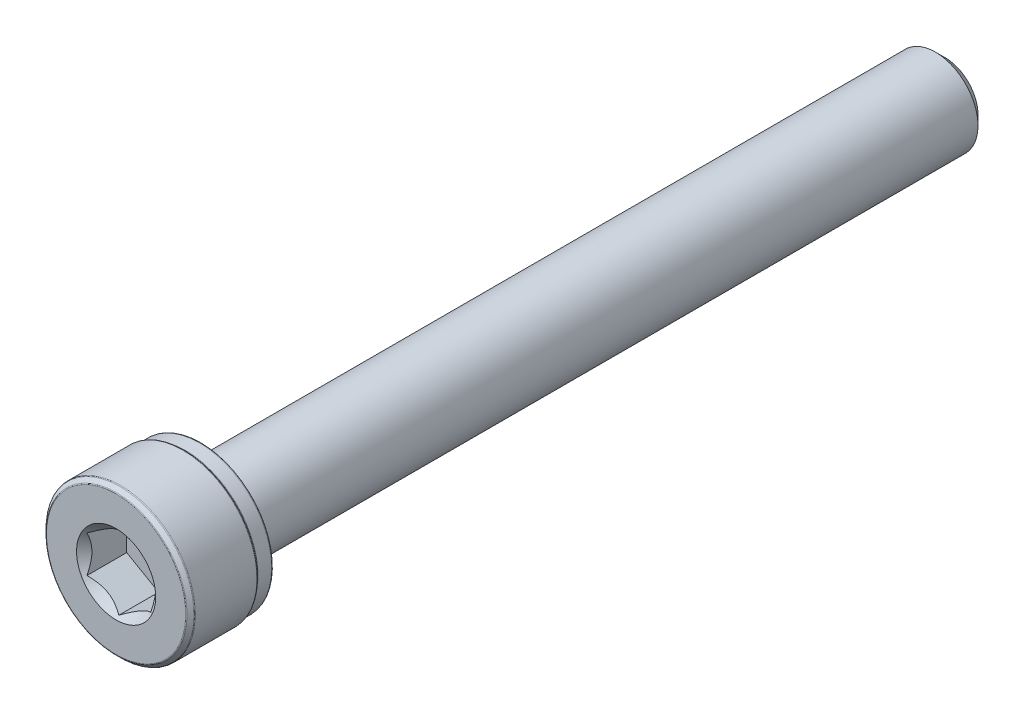
ISO-10303-21;
HEADER;
FILE_DESCRIPTION(('STEP AP214'),'2;1');
FILE_NAME('part.step','',(''),(''),'','','');
FILE_SCHEMA(('AUTOMOTIVE_DESIGN { 1 0 10303 214 1 1 1 1 }'));
ENDSEC;
DATA;
#1=APPLICATION_CONTEXT('core data for automotive mechanical design processes');
#2=APPLICATION_PROTOCOL_DEFINITION('international standard','automotive_design',2000,#1);
#3=PRODUCT_CONTEXT('',#1,'mechanical');
#4=PRODUCT('Part','Part','',(#3));
#5=PRODUCT_RELATED_PRODUCT_CATEGORY('part','',(#4));
#6=PRODUCT_DEFINITION_FORMATION('','',#4);
#7=PRODUCT_DEFINITION_CONTEXT('part definition',#1,'design');
#8=PRODUCT_DEFINITION('design','',#6,#7);
#9=PRODUCT_DEFINITION_SHAPE('','',#8);
#10=(LENGTH_UNIT() NAMED_UNIT(*) SI_UNIT(.MILLI.,.METRE.));
#11=(NAMED_UNIT(*) PLANE_ANGLE_UNIT() SI_UNIT($,.RADIAN.));
#12=(NAMED_UNIT(*) SI_UNIT($,.STERADIAN.) SOLID_ANGLE_UNIT());
#13=UNCERTAINTY_MEASURE_WITH_UNIT(LENGTH_MEASURE(1.E-05),#10,'distance_accuracy_value','');
#14=(GEOMETRIC_REPRESENTATION_CONTEXT(3) GLOBAL_UNCERTAINTY_ASSIGNED_CONTEXT((#13)) GLOBAL_UNIT_ASSIGNED_CONTEXT((#10,
#11,#12)) REPRESENTATION_CONTEXT('',''));
#15=CARTESIAN_POINT('',(0.,0.,0.));
#16=DIRECTION('',(0.,0.,1.));
#17=DIRECTION('',(1.,0.,0.));
#18=AXIS2_PLACEMENT_3D('',#15,#16,#17);
#19=CARTESIAN_POINT('',(0.,1.54533666301317,-19.5));
#20=DIRECTION('',(0.,0.,-1.));
#21=DIRECTION('',(0.,1.,0.));
#22=AXIS2_PLACEMENT_3D('',#19,#20,#21);
#23=PLANE('',#22);
#24=CARTESIAN_POINT('',(0.,0.,-19.5));
#25=DIRECTION('',(0.,0.,-1.));
#26=DIRECTION('',(0.,1.,0.));
#27=AXIS2_PLACEMENT_3D('',#24,#25,#26);
#28=CIRCLE('',#27,1.54533666301317);
#29=CARTESIAN_POINT('',(0.,1.54533666301317,-19.5));
#30=VERTEX_POINT('',#29);
#31=EDGE_CURVE('E51',#30,#30,#28,.T.);
#32=ORIENTED_EDGE('',*,*,#31,.T.);
#33=EDGE_LOOP('',(#32));
#34=FACE_BOUND('',#33,.T.);
#35=ADVANCED_FACE('F38',(#34),#23,.T.);
#36=CARTESIAN_POINT('',(0.,0.,-19.5));
#37=DIRECTION('',(0.,0.,1.));
#38=DIRECTION('',(0.,-1.,0.));
#39=AXIS2_PLACEMENT_3D('',#36,#37,#38);
#40=CONICAL_SURFACE('',#39,1.54533666301317,0.785398163397444);
#41=CARTESIAN_POINT('',(0.,0.,-19.0453366630132));
#42=DIRECTION('',(0.,0.,-1.));
#43=DIRECTION('',(0.,1.,0.));
#44=AXIS2_PLACEMENT_3D('',#41,#42,#43);
#45=CIRCLE('',#44,2.);
#46=CARTESIAN_POINT('',(0.,2.,-19.0453366630132));
#47=VERTEX_POINT('',#46);
#48=EDGE_CURVE('E157',#47,#47,#45,.T.);
#49=ORIENTED_EDGE('',*,*,#48,.T.);
#50=EDGE_LOOP('',(#49));
#51=FACE_BOUND('',#50,.T.);
#52=ORIENTED_EDGE('',*,*,#31,.F.);
#53=EDGE_LOOP('',(#52));
#54=FACE_BOUND('',#53,.T.);
#55=ADVANCED_FACE('F163',(#51,#54),#40,.T.);
#56=CARTESIAN_POINT('',(0.,0.,-19.5));
#57=DIRECTION('',(0.,0.,-1.));
#58=DIRECTION('',(0.,1.,0.));
#59=AXIS2_PLACEMENT_3D('',#56,#57,#58);
#60=CYLINDRICAL_SURFACE('',#59,2.);
#61=CARTESIAN_POINT('',(0.,0.,15.3));
#62=DIRECTION('',(0.,0.,-1.));
#63=DIRECTION('',(0.,1.,0.));
#64=AXIS2_PLACEMENT_3D('',#61,#62,#63);
#65=CIRCLE('',#64,2.);
#66=CARTESIAN_POINT('',(0.,2.,15.3));
#67=VERTEX_POINT('',#66);
#68=EDGE_CURVE('E154',#67,#67,#65,.T.);
#69=ORIENTED_EDGE('',*,*,#68,.T.);
#70=EDGE_LOOP('',(#69));
#71=FACE_BOUND('',#70,.T.);
#72=ORIENTED_EDGE('',*,*,#48,.F.);
#73=EDGE_LOOP('',(#72));
#74=FACE_BOUND('',#73,.T.);
#75=ADVANCED_FACE('F165',(#71,#74),#60,.T.);
#76=CARTESIAN_POINT('',(0.,0.,15.3));
#77=DIRECTION('',(0.,0.,-1.));
#78=DIRECTION('',(0.,1.,0.));
#79=AXIS2_PLACEMENT_3D('',#76,#77,#78);
#80=TOROIDAL_SURFACE('',#79,2.2,0.199999999999998);
#81=CARTESIAN_POINT('',(0.,0.,15.5));
#82=DIRECTION('',(0.,0.,-1.));
#83=DIRECTION('',(0.,1.,0.));
#84=AXIS2_PLACEMENT_3D('',#81,#82,#83);
#85=CIRCLE('',#84,2.2);
#86=CARTESIAN_POINT('',(0.,2.2,15.5));
#87=VERTEX_POINT('',#86);
#88=EDGE_CURVE('E151',#87,#87,#85,.T.);
#89=ORIENTED_EDGE('',*,*,#88,.T.);
#90=EDGE_LOOP('',(#89));
#91=FACE_BOUND('',#90,.T.);
#92=ORIENTED_EDGE('',*,*,#68,.F.);
#93=EDGE_LOOP('',(#92));
#94=FACE_BOUND('',#93,.T.);
#95=ADVANCED_FACE('F171',(#91,#94),#80,.F.);
#96=CARTESIAN_POINT('',(0.,3.3125,15.5));
#97=DIRECTION('',(0.,0.,-1.));
#98=DIRECTION('',(0.,1.,0.));
#99=AXIS2_PLACEMENT_3D('',#96,#97,#98);
#100=PLANE('',#99);
#101=CARTESIAN_POINT('',(0.,0.,15.5));
#102=DIRECTION('',(0.,0.,-1.));
#103=DIRECTION('',(0.,1.,0.));
#104=AXIS2_PLACEMENT_3D('',#101,#102,#103);
#105=CIRCLE('',#104,3.3125);
#106=CARTESIAN_POINT('',(0.,3.3125,15.5));
#107=VERTEX_POINT('',#106);
#108=EDGE_CURVE('E148',#107,#107,#105,.T.);
#109=ORIENTED_EDGE('',*,*,#108,.T.);
#110=EDGE_LOOP('',(#109));
#111=FACE_BOUND('',#110,.T.);
#112=ORIENTED_EDGE('',*,*,#88,.F.);
#113=EDGE_LOOP('',(#112));
#114=FACE_BOUND('',#113,.T.);
#115=ADVANCED_FACE('F177',(#111,#114),#100,.T.);
#116=CARTESIAN_POINT('',(0.,0.,15.5875));
#117=DIRECTION('',(0.,0.,-1.));
#118=DIRECTION('',(0.,1.,0.));
#119=AXIS2_PLACEMENT_3D('',#116,#117,#118);
#120=TOROIDAL_SURFACE('',#119,3.3125,0.087499999999999);
#121=CARTESIAN_POINT('',(0.,0.,15.5875));
#122=DIRECTION('',(0.,0.,-1.));
#123=DIRECTION('',(0.,1.,0.));
#124=AXIS2_PLACEMENT_3D('',#121,#122,#123);
#125=CIRCLE('',#124,3.4);
#126=CARTESIAN_POINT('',(0.,3.4,15.5875));
#127=VERTEX_POINT('',#126);
#128=EDGE_CURVE('E145',#127,#127,#125,.T.);
#129=ORIENTED_EDGE('',*,*,#128,.T.);
#130=EDGE_LOOP('',(#129));
#131=FACE_BOUND('',#130,.T.);
#132=ORIENTED_EDGE('',*,*,#108,.F.);
#133=EDGE_LOOP('',(#132));
#134=FACE_BOUND('',#133,.T.);
#135=ADVANCED_FACE('F181',(#131,#134),#120,.T.);
#136=CARTESIAN_POINT('',(0.,0.,-19.5));
#137=DIRECTION('',(0.,0.,-1.));
#138=DIRECTION('',(0.,1.,0.));
#139=AXIS2_PLACEMENT_3D('',#136,#137,#138);
#140=CYLINDRICAL_SURFACE('',#139,3.4);
#141=CARTESIAN_POINT('',(0.,0.,16.2241116523517));
#142=DIRECTION('',(0.,0.,-1.));
#143=DIRECTION('',(0.,1.,0.));
#144=AXIS2_PLACEMENT_3D('',#141,#142,#143);
#145=CIRCLE('',#144,3.4);
#146=CARTESIAN_POINT('',(0.,3.4,16.2241116523517));
#147=VERTEX_POINT('',#146);
#148=EDGE_CURVE('E142',#147,#147,#145,.T.);
#149=ORIENTED_EDGE('',*,*,#148,.T.);
#150=EDGE_LOOP('',(#149));
#151=FACE_BOUND('',#150,.T.);
#152=ORIENTED_EDGE('',*,*,#128,.F.);
#153=EDGE_LOOP('',(#152));
#154=FACE_BOUND('',#153,.T.);
#155=ADVANCED_FACE('F185',(#151,#154),#140,.T.);
#156=CARTESIAN_POINT('',(0.,0.,16.2241116523517));
#157=DIRECTION('',(0.,0.,-1.));
#158=DIRECTION('',(0.,1.,0.));
#159=AXIS2_PLACEMENT_3D('',#156,#157,#158);
#160=TOROIDAL_SURFACE('',#159,3.4625,0.0625000000000005);
#161=CARTESIAN_POINT('',(0.,0.,16.2683058261758));
#162=DIRECTION('',(0.,0.,-1.));
#163=DIRECTION('',(0.,1.,0.));
#164=AXIS2_PLACEMENT_3D('',#161,#162,#163);
#165=CIRCLE('',#164,3.41830582617584);
#166=CARTESIAN_POINT('',(0.,3.41830582617584,16.2683058261758));
#167=VERTEX_POINT('',#166);
#168=EDGE_CURVE('E139',#167,#167,#165,.T.);
#169=ORIENTED_EDGE('',*,*,#168,.T.);
#170=EDGE_LOOP('',(#169));
#171=FACE_BOUND('',#170,.T.);
#172=ORIENTED_EDGE('',*,*,#148,.F.);
#173=EDGE_LOOP('',(#172));
#174=FACE_BOUND('',#173,.T.);
#175=ADVANCED_FACE('F189',(#171,#174),#160,.F.);
#176=CARTESIAN_POINT('',(0.,0.,16.2683058261758));
#177=DIRECTION('',(0.,0.,1.));
#178=DIRECTION('',(0.,-1.,0.));
#179=AXIS2_PLACEMENT_3D('',#176,#177,#178);
#180=CONICAL_SURFACE('',#179,3.41830582617584,0.785398163397493);
#181=CARTESIAN_POINT('',(0.,0.,16.3316941738242));
#182=DIRECTION('',(0.,0.,-1.));
#183=DIRECTION('',(0.,1.,0.));
#184=AXIS2_PLACEMENT_3D('',#181,#182,#183);
#185=CIRCLE('',#184,3.48169417382416);
#186=CARTESIAN_POINT('',(0.,3.48169417382416,16.3316941738242));
#187=VERTEX_POINT('',#186);
#188=EDGE_CURVE('E136',#187,#187,#185,.T.);
#189=ORIENTED_EDGE('',*,*,#188,.T.);
#190=EDGE_LOOP('',(#189));
#191=FACE_BOUND('',#190,.T.);
#192=ORIENTED_EDGE('',*,*,#168,.F.);
#193=EDGE_LOOP('',(#192));
#194=FACE_BOUND('',#193,.T.);
#195=ADVANCED_FACE('F193',(#191,#194),#180,.T.);
#196=CARTESIAN_POINT('',(0.,0.,16.3758883476483));
#197=DIRECTION('',(0.,0.,-1.));
#198=DIRECTION('',(0.,1.,0.));
#199=AXIS2_PLACEMENT_3D('',#196,#197,#198);
#200=TOROIDAL_SURFACE('',#199,3.4375,0.0624999999999981);
#201=CARTESIAN_POINT('',(0.,0.,16.3758883476483));
#202=DIRECTION('',(0.,0.,-1.));
#203=DIRECTION('',(0.,1.,0.));
#204=AXIS2_PLACEMENT_3D('',#201,#202,#203);
#205=CIRCLE('',#204,3.5);
#206=CARTESIAN_POINT('',(0.,3.5,16.3758883476483));
#207=VERTEX_POINT('',#206);
#208=EDGE_CURVE('E133',#207,#207,#205,.T.);
#209=ORIENTED_EDGE('',*,*,#208,.T.);
#210=EDGE_LOOP('',(#209));
#211=FACE_BOUND('',#210,.T.);
#212=ORIENTED_EDGE('',*,*,#188,.F.);
#213=EDGE_LOOP('',(#212));
#214=FACE_BOUND('',#213,.T.);
#215=ADVANCED_FACE('F197',(#211,#214),#200,.T.);
#216=CARTESIAN_POINT('',(0.,0.,-19.5));
#217=DIRECTION('',(0.,0.,-1.));
#218=DIRECTION('',(0.,1.,0.));
#219=AXIS2_PLACEMENT_3D('',#216,#217,#218);
#220=CYLINDRICAL_SURFACE('',#219,3.5);
#221=CARTESIAN_POINT('',(0.,0.,19.2741116523517));
#222=DIRECTION('',(0.,0.,-1.));
#223=DIRECTION('',(0.,1.,0.));
#224=AXIS2_PLACEMENT_3D('',#221,#222,#223);
#225=CIRCLE('',#224,3.5);
#226=CARTESIAN_POINT('',(0.,3.5,19.2741116523517));
#227=VERTEX_POINT('',#226);
#228=EDGE_CURVE('E130',#227,#227,#225,.T.);
#229=ORIENTED_EDGE('',*,*,#228,.T.);
#230=EDGE_LOOP('',(#229));
#231=FACE_BOUND('',#230,.T.);
#232=ORIENTED_EDGE('',*,*,#208,.F.);
#233=EDGE_LOOP('',(#232));
#234=FACE_BOUND('',#233,.T.);
#235=ADVANCED_FACE('F201',(#231,#234),#220,.T.);
#236=CARTESIAN_POINT('',(0.,0.,19.2741116523517));
#237=DIRECTION('',(0.,0.,-1.));
#238=DIRECTION('',(0.,1.,0.));
#239=AXIS2_PLACEMENT_3D('',#236,#237,#238);
#240=TOROIDAL_SURFACE('',#239,3.4375,0.0625000000000011);
#241=CARTESIAN_POINT('',(0.,0.,19.3183058261758));
#242=DIRECTION('',(0.,0.,-1.));
#243=DIRECTION('',(0.,1.,0.));
#244=AXIS2_PLACEMENT_3D('',#241,#242,#243);
#245=CIRCLE('',#244,3.48169417382416);
#246=CARTESIAN_POINT('',(0.,3.48169417382416,19.3183058261758));
#247=VERTEX_POINT('',#246);
#248=EDGE_CURVE('E127',#247,#247,#245,.T.);
#249=ORIENTED_EDGE('',*,*,#248,.T.);
#250=EDGE_LOOP('',(#249));
#251=FACE_BOUND('',#250,.T.);
#252=ORIENTED_EDGE('',*,*,#228,.F.);
#253=EDGE_LOOP('',(#252));
#254=FACE_BOUND('',#253,.T.);
#255=ADVANCED_FACE('F205',(#251,#254),#240,.T.);
#256=CARTESIAN_POINT('',(0.,0.,19.3183058261758));
#257=DIRECTION('',(0.,0.,-1.));
#258=DIRECTION('',(0.,1.,0.));
#259=AXIS2_PLACEMENT_3D('',#256,#257,#258);
#260=CONICAL_SURFACE('',#259,3.48169417382416,0.785398163397454);
#261=CARTESIAN_POINT('',(0.,0.,19.4816941738242));
#262=DIRECTION('',(0.,0.,-1.));
#263=DIRECTION('',(0.,1.,0.));
#264=AXIS2_PLACEMENT_3D('',#261,#262,#263);
#265=CIRCLE('',#264,3.31830582617584);
#266=CARTESIAN_POINT('',(0.,3.31830582617584,19.4816941738242));
#267=VERTEX_POINT('',#266);
#268=EDGE_CURVE('E124',#267,#267,#265,.T.);
#269=ORIENTED_EDGE('',*,*,#268,.T.);
#270=EDGE_LOOP('',(#269));
#271=FACE_BOUND('',#270,.T.);
#272=ORIENTED_EDGE('',*,*,#248,.F.);
#273=EDGE_LOOP('',(#272));
#274=FACE_BOUND('',#273,.T.);
#275=ADVANCED_FACE('F209',(#271,#274),#260,.T.);
#276=CARTESIAN_POINT('',(0.,0.,19.4375));
#277=DIRECTION('',(0.,0.,-1.));
#278=DIRECTION('',(0.,1.,0.));
#279=AXIS2_PLACEMENT_3D('',#276,#277,#278);
#280=TOROIDAL_SURFACE('',#279,3.27411165235168,0.0624999999999999);
#281=CARTESIAN_POINT('',(0.,0.,19.5));
#282=DIRECTION('',(0.,0.,-1.));
#283=DIRECTION('',(0.,1.,0.));
#284=AXIS2_PLACEMENT_3D('',#281,#282,#283);
#285=CIRCLE('',#284,3.27411165235168);
#286=CARTESIAN_POINT('',(0.,3.27411165235168,19.5));
#287=VERTEX_POINT('',#286);
#288=EDGE_CURVE('E121',#287,#287,#285,.T.);
#289=ORIENTED_EDGE('',*,*,#288,.T.);
#290=EDGE_LOOP('',(#289));
#291=FACE_BOUND('',#290,.T.);
#292=ORIENTED_EDGE('',*,*,#268,.F.);
#293=EDGE_LOOP('',(#292));
#294=FACE_BOUND('',#293,.T.);
#295=ADVANCED_FACE('F213',(#291,#294),#280,.T.);
#296=CARTESIAN_POINT('',(0.,0.,19.5));
#297=DIRECTION('',(0.,0.,1.));
#298=DIRECTION('',(0.,-1.,0.));
#299=AXIS2_PLACEMENT_3D('',#296,#297,#298);
#300=PLANE('',#299);
#301=CARTESIAN_POINT('',(0.,0.,19.5));
#302=DIRECTION('',(0.,0.,1.));
#303=DIRECTION('',(1.,0.,0.));
#304=AXIS2_PLACEMENT_3D('',#301,#302,#303);
#305=CIRCLE('',#304,1.86195461813654);
#306=CARTESIAN_POINT('',(1.86195461813654,0.,19.5));
#307=VERTEX_POINT('',#306);
#308=EDGE_CURVE('E307',#307,#307,#305,.T.);
#309=ORIENTED_EDGE('',*,*,#308,.F.);
#310=EDGE_LOOP('',(#309));
#311=FACE_BOUND('',#310,.T.);
#312=ORIENTED_EDGE('',*,*,#288,.F.);
#313=EDGE_LOOP('',(#312));
#314=FACE_BOUND('',#313,.T.);
#315=ADVANCED_FACE('F217',(#311,#314),#300,.T.);
#316=CARTESIAN_POINT('',(0.,0.,19.5));
#317=DIRECTION('',(0.,0.,1.));
#318=DIRECTION('',(1.,0.,0.));
#319=AXIS2_PLACEMENT_3D('',#316,#317,#318);
#320=CONICAL_SURFACE('',#319,1.86195461813654,0.78539816339745);
#321=ORIENTED_EDGE('',*,*,#308,.T.);
#322=EDGE_LOOP('',(#321));
#323=FACE_BOUND('',#322,.T.);
#324=CARTESIAN_POINT('',(-1.5002,-0.865909933730598,19.3702116710324));
#325=CARTESIAN_POINT('',(-1.44863220926292,-0.895682611594162,19.3404616654997));
#326=CARTESIAN_POINT('',(-1.3962020823348,-0.925953159489762,19.3124586733427));
#327=CARTESIAN_POINT('',(-1.2892909659444,-0.98767832131712,19.2611854198725));
#328=CARTESIAN_POINT('',(-1.23479980418533,-1.01913880822717,19.2379436944767));
#329=CARTESIAN_POINT('',(-1.12492091864275,-1.08257741237344,19.1981299184246));
#330=CARTESIAN_POINT('',(-1.0695611909048,-1.11453936608521,19.1814577751032));
#331=CARTESIAN_POINT('',(-0.957622742522847,-1.1791670593912,19.1557706462504));
#332=CARTESIAN_POINT('',(-0.901047443446989,-1.21183082354213,19.1467364799112));
#333=CARTESIAN_POINT('',(-0.803544610483557,-1.26812411040032,19.1385852706592));
#334=CARTESIAN_POINT('',(-0.762743091719532,-1.29168087824207,19.1373784424216));
#335=CARTESIAN_POINT('',(-0.68121203038414,-1.33875285845138,19.1394102465946));
#336=CARTESIAN_POINT('',(-0.640482505685369,-1.36226806050018,19.1426498601806));
#337=CARTESIAN_POINT('',(-0.559415597836583,-1.40907206156905,19.1533881754143));
#338=CARTESIAN_POINT('',(-0.519078615401711,-1.43236062923612,19.1608908424511));
#339=CARTESIAN_POINT('',(-0.439081663085968,-1.47854689118996,19.1797478013606));
#340=CARTESIAN_POINT('',(-0.399421991483791,-1.50144441326545,19.1911037464509));
#341=CARTESIAN_POINT('',(-0.297836865225514,-1.56009461325633,19.224817837025));
#342=CARTESIAN_POINT('',(-0.23654144629031,-1.59548353987866,19.2497180385257));
#343=CARTESIAN_POINT('',(-0.146414371536686,-1.64751843074894,19.2917528427039));
#344=CARTESIAN_POINT('',(-0.116714860092282,-1.66466545167616,19.3065213429914));
#345=CARTESIAN_POINT('',(-0.0578620986162484,-1.6986441093569,19.3374067553725));
#346=CARTESIAN_POINT('',(-0.0287085957793618,-1.7154758920676,19.3535230235541));
#347=CARTESIAN_POINT('',(0.000200000000001377,-1.73216627762271,19.3702116710324));
#348=B_SPLINE_CURVE_WITH_KNOTS('',3,(#324,#325,#326,#327,#328,#329,#330,#331,#332,#333,#334,
#335,#336,#337,#338,#339,#340,#341,#342,#343,#344,#345,#346,#347),.UNSPECIFIED.,.F.,.F.,(4,2,2,
2,2,2,2,2,2,2,2,4),(0.,0.199829143693305,0.400822987382389,0.59862372053818,0.795926240188887,
0.937113067959878,1.07833105577192,1.21968061668222,1.36109089931054,1.58570969637565,
1.69770705470963,1.80965120737193),.UNSPECIFIED.);
#349=CARTESIAN_POINT('',(-1.5,-0.866025403784435,19.3700961894323));
#350=VERTEX_POINT('',#349);
#351=CARTESIAN_POINT('',(0.,-1.73205080756887,19.3700961894323));
#352=VERTEX_POINT('',#351);
#353=EDGE_CURVE('E105',#350,#352,#348,.T.);
#354=ORIENTED_EDGE('',*,*,#353,.F.);
#355=CARTESIAN_POINT('',(-1.5,-1.817986316849,19.9949658829093));
#356=CARTESIAN_POINT('',(-1.5,-1.77410479833238,19.961123354197));
#357=CARTESIAN_POINT('',(-1.5,-1.72998897047493,19.927585617689));
#358=CARTESIAN_POINT('',(-1.5,-1.64119029432318,19.8612481734927));
#359=CARTESIAN_POINT('',(-1.5,-1.59650731534755,19.828448640911));
#360=CARTESIAN_POINT('',(-1.5,-1.46080694048899,19.7308819314804));
#361=CARTESIAN_POINT('',(-1.5,-1.36880251235632,19.6674654206559));
#362=CARTESIAN_POINT('',(-1.5,-1.17526237686871,19.5421023717216));
#363=CARTESIAN_POINT('',(-1.5,-1.07349393006072,19.4805114153672));
#364=CARTESIAN_POINT('',(-1.5,-0.864764842560624,19.3672522059965));
#365=CARTESIAN_POINT('',(-1.5,-0.757823334449946,19.3155504395058));
#366=CARTESIAN_POINT('',(-1.5,-0.598146069886856,19.2522731736164));
#367=CARTESIAN_POINT('',(-1.5,-0.547969945491556,19.2342740839912));
#368=CARTESIAN_POINT('',(-1.5,-0.446326869364773,19.2022954652208));
#369=CARTESIAN_POINT('',(-1.5,-0.394859836419923,19.1883161896624));
#370=CARTESIAN_POINT('',(-1.5,-0.291848397493323,19.1653656903726));
#371=CARTESIAN_POINT('',(-1.5,-0.24032474962877,19.1563028154328));
#372=CARTESIAN_POINT('',(-1.5,-0.136625448515909,19.1433771152152));
#373=CARTESIAN_POINT('',(-1.5,-0.084449936237778,19.1395131846234));
#374=CARTESIAN_POINT('',(-1.5,0.0176806967011152,19.1373196125689));
#375=CARTESIAN_POINT('',(-1.5,0.0676307045116638,19.1387500692366));
#376=CARTESIAN_POINT('',(-1.5,0.167145477637762,19.1465133142386));
#377=CARTESIAN_POINT('',(-1.5,0.216710207908515,19.1528465433779));
#378=CARTESIAN_POINT('',(-1.5,0.315937150651983,19.1701627170715));
#379=CARTESIAN_POINT('',(-1.5,0.365584733694539,19.1812281518103));
#380=CARTESIAN_POINT('',(-1.5,0.463781606198769,19.2073934991991));
#381=CARTESIAN_POINT('',(-1.5,0.512330953840258,19.2224931975855));
#382=CARTESIAN_POINT('',(-1.5,0.661313023287689,19.2746138556917));
#383=CARTESIAN_POINT('',(-1.5,0.759720789706276,19.3174049630424));
#384=CARTESIAN_POINT('',(-1.5,0.951942669022768,19.4126388372101));
#385=CARTESIAN_POINT('',(-1.5,1.04573912191844,19.465115526486));
#386=CARTESIAN_POINT('',(-1.5,1.22504153577548,19.5734783373155));
#387=CARTESIAN_POINT('',(-1.5,1.3107282773288,19.6290691055441));
#388=CARTESIAN_POINT('',(-1.5,1.43696960041027,19.7150504562164));
#389=CARTESIAN_POINT('',(-1.5,1.47850725450332,19.7440226829709));
#390=CARTESIAN_POINT('',(-1.5,1.56101250374723,19.8027448839378));
#391=CARTESIAN_POINT('',(-1.5,1.60198025290925,19.8324946415183));
#392=CARTESIAN_POINT('',(-1.5,1.64271029717086,19.862567155286));
#393=B_SPLINE_CURVE_WITH_KNOTS('',3,(#355,#356,#357,#358,#359,#360,#361,#362,#363,#364,#365,
#366,#367,#368,#369,#370,#371,#372,#373,#374,#375,#376,#377,#378,#379,#380,#381,#382,#383,#384,
#385,#386,#387,#388,#389,#390,#391,#392),.UNSPECIFIED.,.F.,.F.,(4,2,2,2,2,2,2,2,2,2,2,2,2,2,2,2,
2,2,4),(0.,0.166243250325254,0.332525527595491,0.66761758287406,1.02421660314856,
1.37958485991001,1.53937185590112,1.69916892971771,1.85587466130011,2.01254707142442,
2.16220898927397,2.31188436469118,2.46428258498152,2.61667271286894,2.93766301623295,
3.25979964661298,3.56606529199601,3.71798989158863,3.86987260467918),.UNSPECIFIED.);
#394=CARTESIAN_POINT('',(-1.49999999999999,0.866025403784438,19.3700961894323));
#395=VERTEX_POINT('',#394);
#396=EDGE_CURVE('E263',#395,#350,#393,.F.);
#397=ORIENTED_EDGE('',*,*,#396,.F.);
#398=CARTESIAN_POINT('',(0.000200000000001305,1.73216627762271,19.3702116710324));
#399=CARTESIAN_POINT('',(-0.0513677907370742,1.70239359975915,19.3404616654997));
#400=CARTESIAN_POINT('',(-0.103797917665199,1.67212305186355,19.3124586733427));
#401=CARTESIAN_POINT('',(-0.210709034055595,1.61039789003619,19.2611854198725));
#402=CARTESIAN_POINT('',(-0.265200195814659,1.57893740312614,19.2379436944767));
#403=CARTESIAN_POINT('',(-0.375079081357247,1.51549879897987,19.1981299184246));
#404=CARTESIAN_POINT('',(-0.430438809095198,1.4835368452681,19.1814577751032));
#405=CARTESIAN_POINT('',(-0.542377257477149,1.41890915196211,19.1557706462504));
#406=CARTESIAN_POINT('',(-0.598952556553007,1.38624538781118,19.1467364799112));
#407=CARTESIAN_POINT('',(-0.696455389516439,1.32995210095299,19.1385852706592));
#408=CARTESIAN_POINT('',(-0.737256908280465,1.30639533311124,19.1373784424216));
#409=CARTESIAN_POINT('',(-0.818787969615857,1.25932335290193,19.1394102465946));
#410=CARTESIAN_POINT('',(-0.859517494314628,1.23580815085313,19.1426498601807));
#411=CARTESIAN_POINT('',(-0.940584402163414,1.18900414978426,19.1533881754143));
#412=CARTESIAN_POINT('',(-0.980921384598286,1.16571558211719,19.1608908424511));
#413=CARTESIAN_POINT('',(-1.06091833691403,1.11952932016335,19.1797478013606));
#414=CARTESIAN_POINT('',(-1.10057800851621,1.09663179808786,19.1911037464509));
#415=CARTESIAN_POINT('',(-1.20216313477448,1.03798159809698,19.224817837025));
#416=CARTESIAN_POINT('',(-1.26345855370969,1.00259267147465,19.2497180385257));
#417=CARTESIAN_POINT('',(-1.35358562846331,0.950557780604373,19.2917528427039));
#418=CARTESIAN_POINT('',(-1.38328513990771,0.933410759677147,19.3065213429914));
#419=CARTESIAN_POINT('',(-1.44213790138375,0.899432101996406,19.3374067553725));
#420=CARTESIAN_POINT('',(-1.47129140422063,0.882600319285709,19.3535230235541));
#421=CARTESIAN_POINT('',(-1.5002,0.8659099337306,19.3702116710324));
#422=B_SPLINE_CURVE_WITH_KNOTS('',3,(#398,#399,#400,#401,#402,#403,#404,#405,#406,#407,#408,
#409,#410,#411,#412,#413,#414,#415,#416,#417,#418,#419,#420,#421),.UNSPECIFIED.,.F.,.F.,(4,2,2,
2,2,2,2,2,2,2,2,4),(0.,0.199829143693303,0.400822987382387,0.59862372053818,0.795926240188888,
0.93711306795988,1.07833105577193,1.21968061668222,1.36109089931054,1.58570969637565,
1.69770705470963,1.80965120737193),.UNSPECIFIED.);
#423=CARTESIAN_POINT('',(0.,1.73205080756887,19.3700961894323));
#424=VERTEX_POINT('',#423);
#425=EDGE_CURVE('E257',#424,#395,#422,.T.);
#426=ORIENTED_EDGE('',*,*,#425,.F.);
#427=CARTESIAN_POINT('',(1.5002,0.865909933730597,19.3702116710324));
#428=CARTESIAN_POINT('',(1.44863220926292,0.895682611594162,19.3404616654997));
#429=CARTESIAN_POINT('',(1.3962020823348,0.925953159489761,19.3124586733427));
#430=CARTESIAN_POINT('',(1.2892909659444,0.98767832131712,19.2611854198725));
#431=CARTESIAN_POINT('',(1.23479980418534,1.01913880822717,19.2379436944767));
#432=CARTESIAN_POINT('',(1.12492091864275,1.08257741237344,19.1981299184246));
#433=CARTESIAN_POINT('',(1.0695611909048,1.11453936608521,19.1814577751032));
#434=CARTESIAN_POINT('',(0.957622742522849,1.1791670593912,19.1557706462504));
#435=CARTESIAN_POINT('',(0.901047443446991,1.21183082354213,19.1467364799112));
#436=CARTESIAN_POINT('',(0.803544610483559,1.26812411040032,19.1385852706592));
#437=CARTESIAN_POINT('',(0.762743091719533,1.29168087824207,19.1373784424216));
#438=CARTESIAN_POINT('',(0.681212030384142,1.33875285845138,19.1394102465946));
#439=CARTESIAN_POINT('',(0.64048250568537,1.36226806050018,19.1426498601807));
#440=CARTESIAN_POINT('',(0.559415597836584,1.40907206156905,19.1533881754143));
#441=CARTESIAN_POINT('',(0.519078615401712,1.43236062923612,19.1608908424511));
#442=CARTESIAN_POINT('',(0.43908166308597,1.47854689118996,19.1797478013606));
#443=CARTESIAN_POINT('',(0.399421991483793,1.50144441326545,19.1911037464509));
#444=CARTESIAN_POINT('',(0.297836865225516,1.56009461325633,19.224817837025));
#445=CARTESIAN_POINT('',(0.236541446290313,1.59548353987866,19.2497180385257));
#446=CARTESIAN_POINT('',(0.146414371536689,1.64751843074894,19.2917528427039));
#447=CARTESIAN_POINT('',(0.116714860092286,1.66466545167616,19.3065213429914));
#448=CARTESIAN_POINT('',(0.0578620986162524,1.6986441093569,19.3374067553725));
#449=CARTESIAN_POINT('',(0.0287085957793658,1.7154758920676,19.3535230235541));
#450=CARTESIAN_POINT('',(-0.000199999999997436,1.73216627762271,19.3702116710324));
#451=B_SPLINE_CURVE_WITH_KNOTS('',3,(#427,#428,#429,#430,#431,#432,#433,#434,#435,#436,#437,
#438,#439,#440,#441,#442,#443,#444,#445,#446,#447,#448,#449,#450),.UNSPECIFIED.,.F.,.F.,(4,2,2,
2,2,2,2,2,2,2,2,4),(0.,0.199829143693305,0.40082298738239,0.598623720538183,0.79592624018889,
0.937113067959882,1.07833105577193,1.21968061668222,1.36109089931054,1.58570969637565,
1.69770705470963,1.80965120737193),.UNSPECIFIED.);
#452=CARTESIAN_POINT('',(1.5,0.866025403784435,19.3700961894323));
#453=VERTEX_POINT('',#452);
#454=EDGE_CURVE('E58',#453,#424,#451,.T.);
#455=ORIENTED_EDGE('',*,*,#454,.F.);
#456=CARTESIAN_POINT('',(1.5,-1.817986316849,19.9949658829093));
#457=CARTESIAN_POINT('',(1.5,-1.77410479833237,19.961123354197));
#458=CARTESIAN_POINT('',(1.5,-1.72998897047492,19.927585617689));
#459=CARTESIAN_POINT('',(1.5,-1.64119029432318,19.8612481734927));
#460=CARTESIAN_POINT('',(1.5,-1.59650731534754,19.828448640911));
#461=CARTESIAN_POINT('',(1.5,-1.46080694048899,19.7308819314804));
#462=CARTESIAN_POINT('',(1.5,-1.36880251235631,19.6674654206559));
#463=CARTESIAN_POINT('',(1.5,-1.17526237686871,19.5421023717216));
#464=CARTESIAN_POINT('',(1.5,-1.07349393006071,19.4805114153672));
#465=CARTESIAN_POINT('',(1.5,-0.864764842560619,19.3672522059965));
#466=CARTESIAN_POINT('',(1.5,-0.757823334449942,19.3155504395058));
#467=CARTESIAN_POINT('',(1.5,-0.598146069886852,19.2522731736164));
#468=CARTESIAN_POINT('',(1.5,-0.547969945491552,19.2342740839912));
#469=CARTESIAN_POINT('',(1.5,-0.446326869364769,19.2022954652208));
#470=CARTESIAN_POINT('',(1.5,-0.39485983641992,19.1883161896624));
#471=CARTESIAN_POINT('',(1.5,-0.29184839749332,19.1653656903726));
#472=CARTESIAN_POINT('',(1.5,-0.240324749628767,19.1563028154328));
#473=CARTESIAN_POINT('',(1.5,-0.136625448515907,19.1433771152152));
#474=CARTESIAN_POINT('',(1.5,-0.0844499362377771,19.1395131846234));
#475=CARTESIAN_POINT('',(1.5,0.0176806967011154,19.1373196125689));
#476=CARTESIAN_POINT('',(1.5,0.067630704511664,19.1387500692366));
#477=CARTESIAN_POINT('',(1.5,0.167145477637762,19.1465133142386));
#478=CARTESIAN_POINT('',(1.5,0.216710207908515,19.1528465433779));
#479=CARTESIAN_POINT('',(1.5,0.315937150651983,19.1701627170715));
#480=CARTESIAN_POINT('',(1.5,0.36558473369454,19.1812281518103));
#481=CARTESIAN_POINT('',(1.5,0.463781606198771,19.2073934991991));
#482=CARTESIAN_POINT('',(1.5,0.51233095384026,19.2224931975855));
#483=CARTESIAN_POINT('',(1.5,0.66131302328769,19.2746138556917));
#484=CARTESIAN_POINT('',(1.5,0.759720789706277,19.3174049630424));
#485=CARTESIAN_POINT('',(1.5,0.95194266902277,19.4126388372101));
#486=CARTESIAN_POINT('',(1.5,1.04573912191844,19.465115526486));
#487=CARTESIAN_POINT('',(1.5,1.22504153577549,19.5734783373155));
#488=CARTESIAN_POINT('',(1.5,1.3107282773288,19.6290691055441));
#489=CARTESIAN_POINT('',(1.5,1.43696960041028,19.7150504562164));
#490=CARTESIAN_POINT('',(1.5,1.47850725450332,19.7440226829709));
#491=CARTESIAN_POINT('',(1.5,1.56101250374723,19.8027448839378));
#492=CARTESIAN_POINT('',(1.5,1.60198025290925,19.8324946415183));
#493=CARTESIAN_POINT('',(1.5,1.64271029717086,19.8625671552861));
#494=B_SPLINE_CURVE_WITH_KNOTS('',3,(#456,#457,#458,#459,#460,#461,#462,#463,#464,#465,#466,
#467,#468,#469,#470,#471,#472,#473,#474,#475,#476,#477,#478,#479,#480,#481,#482,#483,#484,#485,
#486,#487,#488,#489,#490,#491,#492,#493),.UNSPECIFIED.,.F.,.F.,(4,2,2,2,2,2,2,2,2,2,2,2,2,2,2,2,
2,2,4),(0.,0.166243250325255,0.332525527595494,0.667617582874059,1.02421660314856,1.37958485991,
1.53937185590111,1.69916892971771,1.8558746613001,2.01254707142441,2.16220898927396,
2.31188436469117,2.46428258498151,2.61667271286893,2.93766301623294,3.25979964661297,
3.56606529199601,3.71798989158863,3.86987260467918),.UNSPECIFIED.);
#495=CARTESIAN_POINT('',(1.5,-0.866025403784433,19.3700961894323));
#496=VERTEX_POINT('',#495);
#497=EDGE_CURVE('E12',#496,#453,#494,.T.);
#498=ORIENTED_EDGE('',*,*,#497,.F.);
#499=CARTESIAN_POINT('',(-0.000199999999998233,-1.73216627762271,19.3702116710324));
#500=CARTESIAN_POINT('',(0.0513677907370776,-1.70239359975915,19.3404616654997));
#501=CARTESIAN_POINT('',(0.103797917665203,-1.67212305186355,19.3124586733427));
#502=CARTESIAN_POINT('',(0.210709034055598,-1.61039789003619,19.2611854198725));
#503=CARTESIAN_POINT('',(0.265200195814662,-1.57893740312614,19.2379436944767));
#504=CARTESIAN_POINT('',(0.375079081357248,-1.51549879897987,19.1981299184246));
#505=CARTESIAN_POINT('',(0.430438809095199,-1.4835368452681,19.1814577751032));
#506=CARTESIAN_POINT('',(0.54237725747715,-1.41890915196211,19.1557706462504));
#507=CARTESIAN_POINT('',(0.598952556553008,-1.38624538781118,19.1467364799112));
#508=CARTESIAN_POINT('',(0.696455389516439,-1.32995210095299,19.1385852706592));
#509=CARTESIAN_POINT('',(0.737256908280465,-1.30639533311124,19.1373784424216));
#510=CARTESIAN_POINT('',(0.818787969615856,-1.25932335290193,19.1394102465946));
#511=CARTESIAN_POINT('',(0.859517494314628,-1.23580815085313,19.1426498601807));
#512=CARTESIAN_POINT('',(0.940584402163413,-1.18900414978426,19.1533881754143));
#513=CARTESIAN_POINT('',(0.980921384598285,-1.16571558211719,19.1608908424511));
#514=CARTESIAN_POINT('',(1.06091833691403,-1.11952932016335,19.1797478013606));
#515=CARTESIAN_POINT('',(1.1005780085162,-1.09663179808786,19.1911037464509));
#516=CARTESIAN_POINT('',(1.20216313477448,-1.03798159809698,19.224817837025));
#517=CARTESIAN_POINT('',(1.26345855370969,-1.00259267147465,19.2497180385257));
#518=CARTESIAN_POINT('',(1.35358562846331,-0.95055778060437,19.2917528427039));
#519=CARTESIAN_POINT('',(1.38328513990772,-0.933410759677143,19.3065213429914));
#520=CARTESIAN_POINT('',(1.44213790138375,-0.899432101996402,19.3374067553725));
#521=CARTESIAN_POINT('',(1.47129140422064,-0.882600319285704,19.3535230235541));
#522=CARTESIAN_POINT('',(1.5002,-0.865909933730595,19.3702116710324));
#523=B_SPLINE_CURVE_WITH_KNOTS('',3,(#499,#500,#501,#502,#503,#504,#505,#506,#507,#508,#509,
#510,#511,#512,#513,#514,#515,#516,#517,#518,#519,#520,#521,#522),.UNSPECIFIED.,.F.,.F.,(4,2,2,
2,2,2,2,2,2,2,2,4),(0.,0.199829143693304,0.400822987382386,0.598623720538178,0.795926240188885,
0.937113067959877,1.07833105577192,1.21968061668221,1.36109089931054,1.58570969637565,
1.69770705470963,1.80965120737194),.UNSPECIFIED.);
#524=EDGE_CURVE('E96',#352,#496,#523,.T.);
#525=ORIENTED_EDGE('',*,*,#524,.F.);
#526=EDGE_LOOP('',(#354,#397,#426,#455,#498,#525));
#527=FACE_BOUND('',#526,.T.);
#528=ADVANCED_FACE('F95',(#323,#527),#320,.F.);
#529=CARTESIAN_POINT('',(0.,0.,17.5));
#530=DIRECTION('',(0.,0.,1.));
#531=DIRECTION('',(1.,0.,0.));
#532=AXIS2_PLACEMENT_3D('',#529,#530,#531);
#533=PLANE('',#532);
#534=DIRECTION('',(0.866025403784438,0.500000000000001,0.));
#535=VECTOR('',#534,1.);
#536=CARTESIAN_POINT('',(0.,-1.73205080756887,17.5));
#537=LINE('',#536,#535);
#538=CARTESIAN_POINT('',(0.,-1.73205080756887,17.5));
#539=VERTEX_POINT('',#538);
#540=CARTESIAN_POINT('',(1.5,-0.866025403784433,17.5));
#541=VERTEX_POINT('',#540);
#542=EDGE_CURVE('E104',#539,#541,#537,.T.);
#543=ORIENTED_EDGE('',*,*,#542,.T.);
#544=DIRECTION('',(0.,1.,0.));
#545=VECTOR('',#544,1.);
#546=CARTESIAN_POINT('',(1.5,-0.866025403784433,17.5));
#547=LINE('',#546,#545);
#548=CARTESIAN_POINT('',(1.5,0.866025403784435,17.5));
#549=VERTEX_POINT('',#548);
#550=EDGE_CURVE('E109',#541,#549,#547,.T.);
#551=ORIENTED_EDGE('',*,*,#550,.T.);
#552=DIRECTION('',(-0.866025403784438,0.5,0.));
#553=VECTOR('',#552,1.);
#554=CARTESIAN_POINT('',(1.5,0.866025403784435,17.5));
#555=LINE('',#554,#553);
#556=CARTESIAN_POINT('',(0.,1.73205080756887,17.5));
#557=VERTEX_POINT('',#556);
#558=EDGE_CURVE('E289',#549,#557,#555,.T.);
#559=ORIENTED_EDGE('',*,*,#558,.T.);
#560=DIRECTION('',(-0.866025403784439,-0.5,0.));
#561=VECTOR('',#560,1.);
#562=CARTESIAN_POINT('',(0.,1.73205080756887,17.5));
#563=LINE('',#562,#561);
#564=CARTESIAN_POINT('',(-1.5,0.866025403784438,17.5));
#565=VERTEX_POINT('',#564);
#566=EDGE_CURVE('E293',#557,#565,#563,.T.);
#567=ORIENTED_EDGE('',*,*,#566,.T.);
#568=DIRECTION('',(0.,-1.,0.));
#569=VECTOR('',#568,1.);
#570=CARTESIAN_POINT('',(-1.5,0.866025403784438,17.5));
#571=LINE('',#570,#569);
#572=CARTESIAN_POINT('',(-1.5,-0.866025403784435,17.5));
#573=VERTEX_POINT('',#572);
#574=EDGE_CURVE('E117',#565,#573,#571,.T.);
#575=ORIENTED_EDGE('',*,*,#574,.T.);
#576=DIRECTION('',(0.866025403784439,-0.5,0.));
#577=VECTOR('',#576,1.);
#578=CARTESIAN_POINT('',(-1.5,-0.866025403784435,17.5));
#579=LINE('',#578,#577);
#580=EDGE_CURVE('E112',#573,#539,#579,.T.);
#581=ORIENTED_EDGE('',*,*,#580,.T.);
#582=EDGE_LOOP('',(#543,#551,#559,#567,#575,#581));
#583=FACE_BOUND('',#582,.T.);
#584=ADVANCED_FACE('F243',(#583),#533,.T.);
#585=CARTESIAN_POINT('',(1.5,-0.866025403784433,17.5));
#586=DIRECTION('',(1.,0.,0.));
#587=DIRECTION('',(0.,0.,-1.));
#588=AXIS2_PLACEMENT_3D('',#585,#586,#587);
#589=PLANE('',#588);
#590=DIRECTION('',(0.,0.,1.));
#591=VECTOR('',#590,1.);
#592=CARTESIAN_POINT('',(1.5,-0.866025403784433,17.5));
#593=LINE('',#592,#591);
#594=EDGE_CURVE('E102',#541,#496,#593,.T.);
#595=ORIENTED_EDGE('',*,*,#594,.T.);
#596=ORIENTED_EDGE('',*,*,#497,.T.);
#597=DIRECTION('',(0.,0.,1.));
#598=VECTOR('',#597,1.);
#599=CARTESIAN_POINT('',(1.5,0.866025403784435,17.5));
#600=LINE('',#599,#598);
#601=EDGE_CURVE('E111',#549,#453,#600,.T.);
#602=ORIENTED_EDGE('',*,*,#601,.F.);
#603=ORIENTED_EDGE('',*,*,#550,.F.);
#604=EDGE_LOOP('',(#595,#596,#602,#603));
#605=FACE_BOUND('',#604,.T.);
#606=ADVANCED_FACE('F107',(#605),#589,.F.);
#607=CARTESIAN_POINT('',(1.5,0.866025403784435,17.5));
#608=DIRECTION('',(0.5,0.866025403784438,0.));
#609=DIRECTION('',(-0.866025403784439,0.5,0.));
#610=AXIS2_PLACEMENT_3D('',#607,#608,#609);
#611=PLANE('',#610);
#612=ORIENTED_EDGE('',*,*,#601,.T.);
#613=ORIENTED_EDGE('',*,*,#454,.T.);
#614=DIRECTION('',(0.,0.,1.));
#615=VECTOR('',#614,1.);
#616=CARTESIAN_POINT('',(0.,1.73205080756887,17.5));
#617=LINE('',#616,#615);
#618=EDGE_CURVE('E114',#557,#424,#617,.T.);
#619=ORIENTED_EDGE('',*,*,#618,.F.);
#620=ORIENTED_EDGE('',*,*,#558,.F.);
#621=EDGE_LOOP('',(#612,#613,#619,#620));
#622=FACE_BOUND('',#621,.T.);
#623=ADVANCED_FACE('F278',(#622),#611,.F.);
#624=CARTESIAN_POINT('',(0.,1.73205080756887,17.5));
#625=DIRECTION('',(-0.5,0.866025403784439,0.));
#626=DIRECTION('',(-0.866025403784439,-0.5,0.));
#627=AXIS2_PLACEMENT_3D('',#624,#625,#626);
#628=PLANE('',#627);
#629=ORIENTED_EDGE('',*,*,#618,.T.);
#630=ORIENTED_EDGE('',*,*,#425,.T.);
#631=DIRECTION('',(0.,0.,1.));
#632=VECTOR('',#631,1.);
#633=CARTESIAN_POINT('',(-1.5,0.866025403784438,17.5));
#634=LINE('',#633,#632);
#635=EDGE_CURVE('E303',#565,#395,#634,.T.);
#636=ORIENTED_EDGE('',*,*,#635,.F.);
#637=ORIENTED_EDGE('',*,*,#566,.F.);
#638=EDGE_LOOP('',(#629,#630,#636,#637));
#639=FACE_BOUND('',#638,.T.);
#640=ADVANCED_FACE('F273',(#639),#628,.F.);
#641=CARTESIAN_POINT('',(-1.5,0.866025403784438,17.5));
#642=DIRECTION('',(-1.,0.,0.));
#643=DIRECTION('',(0.,0.,1.));
#644=AXIS2_PLACEMENT_3D('',#641,#642,#643);
#645=PLANE('',#644);
#646=ORIENTED_EDGE('',*,*,#635,.T.);
#647=ORIENTED_EDGE('',*,*,#396,.T.);
#648=DIRECTION('',(0.,0.,1.));
#649=VECTOR('',#648,1.);
#650=CARTESIAN_POINT('',(-1.5,-0.866025403784435,17.5));
#651=LINE('',#650,#649);
#652=EDGE_CURVE('E300',#573,#350,#651,.T.);
#653=ORIENTED_EDGE('',*,*,#652,.F.);
#654=ORIENTED_EDGE('',*,*,#574,.F.);
#655=EDGE_LOOP('',(#646,#647,#653,#654));
#656=FACE_BOUND('',#655,.T.);
#657=ADVANCED_FACE('F270',(#656),#645,.F.);
#658=CARTESIAN_POINT('',(-1.5,-0.866025403784435,17.5));
#659=DIRECTION('',(-0.5,-0.866025403784439,0.));
#660=DIRECTION('',(0.866025403784439,-0.5,0.));
#661=AXIS2_PLACEMENT_3D('',#658,#659,#660);
#662=PLANE('',#661);
#663=ORIENTED_EDGE('',*,*,#652,.T.);
#664=ORIENTED_EDGE('',*,*,#353,.T.);
#665=DIRECTION('',(0.,0.,1.));
#666=VECTOR('',#665,1.);
#667=CARTESIAN_POINT('',(0.,-1.73205080756887,17.5));
#668=LINE('',#667,#666);
#669=EDGE_CURVE('E65',#539,#352,#668,.T.);
#670=ORIENTED_EDGE('',*,*,#669,.F.);
#671=ORIENTED_EDGE('',*,*,#580,.F.);
#672=EDGE_LOOP('',(#663,#664,#670,#671));
#673=FACE_BOUND('',#672,.T.);
#674=ADVANCED_FACE('F224',(#673),#662,.F.);
#675=CARTESIAN_POINT('',(0.,-1.73205080756887,17.5));
#676=DIRECTION('',(0.500000000000001,-0.866025403784438,0.));
#677=DIRECTION('',(0.866025403784438,0.500000000000001,0.));
#678=AXIS2_PLACEMENT_3D('',#675,#676,#677);
#679=PLANE('',#678);
#680=ORIENTED_EDGE('',*,*,#669,.T.);
#681=ORIENTED_EDGE('',*,*,#524,.T.);
#682=ORIENTED_EDGE('',*,*,#594,.F.);
#683=ORIENTED_EDGE('',*,*,#542,.F.);
#684=EDGE_LOOP('',(#680,#681,#682,#683));
#685=FACE_BOUND('',#684,.T.);
#686=ADVANCED_FACE('F101',(#685),#679,.F.);
#687=CLOSED_SHELL('',(#35,#55,#75,#95,#115,#135,#155,#175,#195,#215,#235,#255,#275,#295,#315,
#528,#584,#606,#623,#640,#657,#674,#686));
#688=MANIFOLD_SOLID_BREP('B2',#687);
#689=ADVANCED_BREP_SHAPE_REPRESENTATION('',(#18,#688),#14);
#690=SHAPE_DEFINITION_REPRESENTATION(#9,#689);
ENDSEC;
END-ISO-10303-21;
